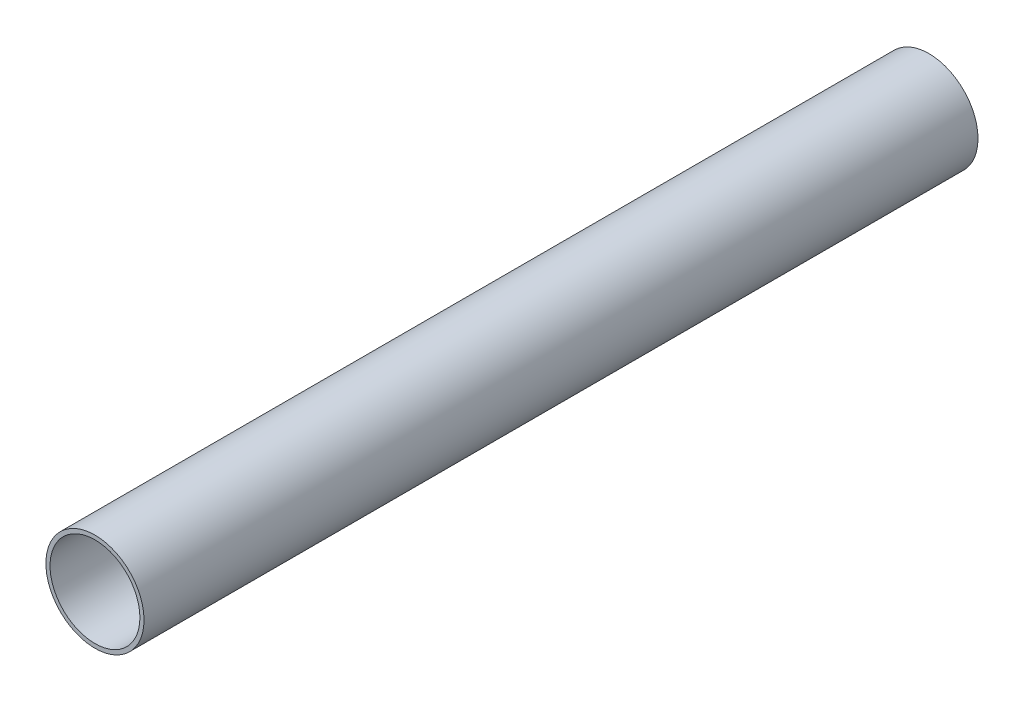
ISO-10303-21;
HEADER;
FILE_DESCRIPTION(('STEP AP214'),'2;1');
FILE_NAME('part.step','',(''),(''),'','','');
FILE_SCHEMA(('AUTOMOTIVE_DESIGN { 1 0 10303 214 1 1 1 1 }'));
ENDSEC;
DATA;
#1=APPLICATION_CONTEXT('core data for automotive mechanical design processes');
#2=APPLICATION_PROTOCOL_DEFINITION('international standard','automotive_design',2000,#1);
#3=PRODUCT_CONTEXT('',#1,'mechanical');
#4=PRODUCT('Part','Part','',(#3));
#5=PRODUCT_RELATED_PRODUCT_CATEGORY('part','',(#4));
#6=PRODUCT_DEFINITION_FORMATION('','',#4);
#7=PRODUCT_DEFINITION_CONTEXT('part definition',#1,'design');
#8=PRODUCT_DEFINITION('design','',#6,#7);
#9=PRODUCT_DEFINITION_SHAPE('','',#8);
#10=(LENGTH_UNIT() NAMED_UNIT(*) SI_UNIT(.MILLI.,.METRE.));
#11=(NAMED_UNIT(*) PLANE_ANGLE_UNIT() SI_UNIT($,.RADIAN.));
#12=(NAMED_UNIT(*) SI_UNIT($,.STERADIAN.) SOLID_ANGLE_UNIT());
#13=UNCERTAINTY_MEASURE_WITH_UNIT(LENGTH_MEASURE(1.E-05),#10,'distance_accuracy_value','');
#14=(GEOMETRIC_REPRESENTATION_CONTEXT(3) GLOBAL_UNCERTAINTY_ASSIGNED_CONTEXT((#13)) GLOBAL_UNIT_ASSIGNED_CONTEXT((#10,
#11,#12)) REPRESENTATION_CONTEXT('',''));
#15=CARTESIAN_POINT('',(0.,0.,0.));
#16=DIRECTION('',(0.,0.,1.));
#17=DIRECTION('',(1.,0.,0.));
#18=AXIS2_PLACEMENT_3D('',#15,#16,#17);
#19=CARTESIAN_POINT('',(11.6332,0.,0.));
#20=DIRECTION('',(0.,0.,-1.));
#21=DIRECTION('',(-1.,0.,0.));
#22=AXIS2_PLACEMENT_3D('',#19,#20,#21);
#23=PLANE('',#22);
#24=CARTESIAN_POINT('',(0.,0.,0.));
#25=DIRECTION('',(0.,0.,1.));
#26=DIRECTION('',(1.,0.,0.));
#27=AXIS2_PLACEMENT_3D('',#24,#25,#26);
#28=CIRCLE('',#27,11.6332);
#29=CARTESIAN_POINT('',(11.6332,0.,0.));
#30=VERTEX_POINT('',#29);
#31=EDGE_CURVE('E58',#30,#30,#28,.T.);
#32=ORIENTED_EDGE('',*,*,#31,.T.);
#33=EDGE_LOOP('',(#32));
#34=FACE_BOUND('',#33,.T.);
#35=CARTESIAN_POINT('',(0.,0.,0.));
#36=DIRECTION('',(0.,0.,1.));
#37=DIRECTION('',(1.,0.,0.));
#38=AXIS2_PLACEMENT_3D('',#35,#36,#37);
#39=CIRCLE('',#38,12.7);
#40=CARTESIAN_POINT('',(12.7,0.,0.));
#41=VERTEX_POINT('',#40);
#42=EDGE_CURVE('E10',#41,#41,#39,.T.);
#43=ORIENTED_EDGE('',*,*,#42,.F.);
#44=EDGE_LOOP('',(#43));
#45=FACE_BOUND('',#44,.T.);
#46=ADVANCED_FACE('F41',(#34,#45),#23,.T.);
#47=CARTESIAN_POINT('',(0.,0.,0.));
#48=DIRECTION('',(0.,0.,1.));
#49=DIRECTION('',(1.,0.,0.));
#50=AXIS2_PLACEMENT_3D('',#47,#48,#49);
#51=CYLINDRICAL_SURFACE('',#50,12.7);
#52=ORIENTED_EDGE('',*,*,#42,.T.);
#53=EDGE_LOOP('',(#52));
#54=FACE_BOUND('',#53,.T.);
#55=CARTESIAN_POINT('',(0.,0.,215.9));
#56=DIRECTION('',(0.,0.,1.));
#57=DIRECTION('',(1.,0.,0.));
#58=AXIS2_PLACEMENT_3D('',#55,#56,#57);
#59=CIRCLE('',#58,12.7);
#60=CARTESIAN_POINT('',(12.7,0.,215.9));
#61=VERTEX_POINT('',#60);
#62=EDGE_CURVE('E48',#61,#61,#59,.T.);
#63=ORIENTED_EDGE('',*,*,#62,.F.);
#64=EDGE_LOOP('',(#63));
#65=FACE_BOUND('',#64,.T.);
#66=ADVANCED_FACE('F75',(#54,#65),#51,.T.);
#67=CARTESIAN_POINT('',(12.7,0.,215.9));
#68=DIRECTION('',(0.,0.,1.));
#69=DIRECTION('',(1.,0.,0.));
#70=AXIS2_PLACEMENT_3D('',#67,#68,#69);
#71=PLANE('',#70);
#72=ORIENTED_EDGE('',*,*,#62,.T.);
#73=EDGE_LOOP('',(#72));
#74=FACE_BOUND('',#73,.T.);
#75=CARTESIAN_POINT('',(0.,0.,215.9));
#76=DIRECTION('',(0.,0.,1.));
#77=DIRECTION('',(1.,0.,0.));
#78=AXIS2_PLACEMENT_3D('',#75,#76,#77);
#79=CIRCLE('',#78,11.6332);
#80=CARTESIAN_POINT('',(11.6332,0.,215.9));
#81=VERTEX_POINT('',#80);
#82=EDGE_CURVE('E53',#81,#81,#79,.T.);
#83=ORIENTED_EDGE('',*,*,#82,.F.);
#84=EDGE_LOOP('',(#83));
#85=FACE_BOUND('',#84,.T.);
#86=ADVANCED_FACE('F69',(#74,#85),#71,.T.);
#87=CARTESIAN_POINT('',(0.,0.,0.));
#88=DIRECTION('',(0.,0.,1.));
#89=DIRECTION('',(1.,0.,0.));
#90=AXIS2_PLACEMENT_3D('',#87,#88,#89);
#91=CYLINDRICAL_SURFACE('',#90,11.6332);
#92=ORIENTED_EDGE('',*,*,#82,.T.);
#93=EDGE_LOOP('',(#92));
#94=FACE_BOUND('',#93,.T.);
#95=ORIENTED_EDGE('',*,*,#31,.F.);
#96=EDGE_LOOP('',(#95));
#97=FACE_BOUND('',#96,.T.);
#98=ADVANCED_FACE('F67',(#94,#97),#91,.F.);
#99=CLOSED_SHELL('',(#46,#66,#86,#98));
#100=MANIFOLD_SOLID_BREP('B2',#99);
#101=ADVANCED_BREP_SHAPE_REPRESENTATION('',(#18,#100),#14);
#102=SHAPE_DEFINITION_REPRESENTATION(#9,#101);
ENDSEC;
END-ISO-10303-21;
